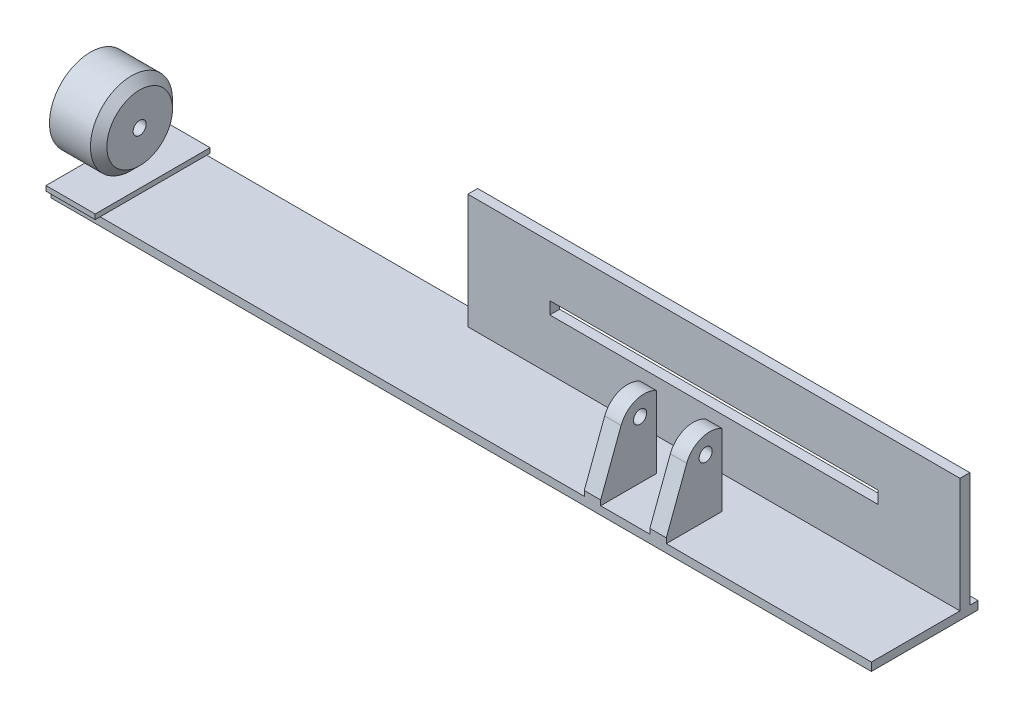
ISO-10303-21;
HEADER;
FILE_DESCRIPTION(('STEP AP214'),'2;1');
FILE_NAME('part.step','',(''),(''),'','','');
FILE_SCHEMA(('AUTOMOTIVE_DESIGN { 1 0 10303 214 1 1 1 1 }'));
ENDSEC;
DATA;
#1=APPLICATION_CONTEXT('core data for automotive mechanical design processes');
#2=APPLICATION_PROTOCOL_DEFINITION('international standard','automotive_design',2000,#1);
#3=PRODUCT_CONTEXT('',#1,'mechanical');
#4=PRODUCT('Part','Part','',(#3));
#5=PRODUCT_RELATED_PRODUCT_CATEGORY('part','',(#4));
#6=PRODUCT_DEFINITION_FORMATION('','',#4);
#7=PRODUCT_DEFINITION_CONTEXT('part definition',#1,'design');
#8=PRODUCT_DEFINITION('design','',#6,#7);
#9=PRODUCT_DEFINITION_SHAPE('','',#8);
#10=(LENGTH_UNIT() NAMED_UNIT(*) SI_UNIT(.MILLI.,.METRE.));
#11=(NAMED_UNIT(*) PLANE_ANGLE_UNIT() SI_UNIT($,.RADIAN.));
#12=(NAMED_UNIT(*) SI_UNIT($,.STERADIAN.) SOLID_ANGLE_UNIT());
#13=UNCERTAINTY_MEASURE_WITH_UNIT(LENGTH_MEASURE(1.E-05),#10,'distance_accuracy_value','');
#14=(GEOMETRIC_REPRESENTATION_CONTEXT(3) GLOBAL_UNCERTAINTY_ASSIGNED_CONTEXT((#13)) GLOBAL_UNIT_ASSIGNED_CONTEXT((#10,
#11,#12)) REPRESENTATION_CONTEXT('',''));
#15=CARTESIAN_POINT('',(0.,0.,0.));
#16=DIRECTION('',(0.,0.,1.));
#17=DIRECTION('',(1.,0.,0.));
#18=AXIS2_PLACEMENT_3D('',#15,#16,#17);
#19=CARTESIAN_POINT('',(-220.,40.,8.49999999999999));
#20=DIRECTION('',(-1.,0.,0.));
#21=DIRECTION('',(0.,0.,1.));
#22=AXIS2_PLACEMENT_3D('',#19,#20,#21);
#23=CYLINDRICAL_SURFACE('',#22,25.);
#24=CARTESIAN_POINT('',(-225.,40.,8.49999999999999));
#25=DIRECTION('',(1.,0.,0.));
#26=DIRECTION('',(0.,0.,-1.));
#27=AXIS2_PLACEMENT_3D('',#24,#25,#26);
#28=CIRCLE('',#27,25.);
#29=CARTESIAN_POINT('',(-225.,40.,-16.5));
#30=VERTEX_POINT('',#29);
#31=EDGE_CURVE('E11',#30,#30,#28,.F.);
#32=ORIENTED_EDGE('',*,*,#31,.T.);
#33=EDGE_LOOP('',(#32));
#34=FACE_BOUND('',#33,.T.);
#35=CARTESIAN_POINT('',(-250.,40.,8.49999999999999));
#36=DIRECTION('',(1.,0.,0.));
#37=DIRECTION('',(0.,0.,-1.));
#38=AXIS2_PLACEMENT_3D('',#35,#36,#37);
#39=CIRCLE('',#38,25.);
#40=CARTESIAN_POINT('',(-250.,40.,-16.5));
#41=VERTEX_POINT('',#40);
#42=EDGE_CURVE('E60',#41,#41,#39,.T.);
#43=ORIENTED_EDGE('',*,*,#42,.T.);
#44=EDGE_LOOP('',(#43));
#45=FACE_BOUND('',#44,.T.);
#46=ADVANCED_FACE('F49',(#34,#45),#23,.T.);
#47=CARTESIAN_POINT('',(-220.,40.,8.49999999999999));
#48=DIRECTION('',(1.,0.,0.));
#49=DIRECTION('',(0.,0.,-1.));
#50=AXIS2_PLACEMENT_3D('',#47,#48,#49);
#51=PLANE('',#50);
#52=CARTESIAN_POINT('',(-220.,40.,8.49999999999999));
#53=DIRECTION('',(1.,0.,0.));
#54=DIRECTION('',(0.,0.,-1.));
#55=AXIS2_PLACEMENT_3D('',#52,#53,#54);
#56=CIRCLE('',#55,4.);
#57=CARTESIAN_POINT('',(-220.,40.,4.49999999999998));
#58=VERTEX_POINT('',#57);
#59=EDGE_CURVE('E67',#58,#58,#56,.T.);
#60=ORIENTED_EDGE('',*,*,#59,.F.);
#61=EDGE_LOOP('',(#60));
#62=FACE_BOUND('',#61,.T.);
#63=CARTESIAN_POINT('',(-220.,40.,8.49999999999999));
#64=DIRECTION('',(1.,0.,0.));
#65=DIRECTION('',(0.,0.,-1.));
#66=AXIS2_PLACEMENT_3D('',#63,#64,#65);
#67=CIRCLE('',#66,20.);
#68=CARTESIAN_POINT('',(-220.,40.,-11.5));
#69=VERTEX_POINT('',#68);
#70=EDGE_CURVE('E56',#69,#69,#67,.T.);
#71=ORIENTED_EDGE('',*,*,#70,.T.);
#72=EDGE_LOOP('',(#71));
#73=FACE_BOUND('',#72,.T.);
#74=ADVANCED_FACE('F81',(#62,#73),#51,.T.);
#75=CARTESIAN_POINT('',(-250.,40.,8.49999999999999));
#76=DIRECTION('',(1.,0.,0.));
#77=DIRECTION('',(0.,0.,-1.));
#78=AXIS2_PLACEMENT_3D('',#75,#76,#77);
#79=PLANE('',#78);
#80=ORIENTED_EDGE('',*,*,#42,.F.);
#81=EDGE_LOOP('',(#80));
#82=FACE_BOUND('',#81,.T.);
#83=ADVANCED_FACE('F83',(#82),#79,.F.);
#84=CARTESIAN_POINT('',(-220.,40.,8.49999999999999));
#85=DIRECTION('',(-1.,0.,0.));
#86=DIRECTION('',(0.,0.,1.));
#87=AXIS2_PLACEMENT_3D('',#84,#85,#86);
#88=CONICAL_SURFACE('',#87,20.,0.785398163397446);
#89=ORIENTED_EDGE('',*,*,#31,.F.);
#90=EDGE_LOOP('',(#89));
#91=FACE_BOUND('',#90,.T.);
#92=ORIENTED_EDGE('',*,*,#70,.F.);
#93=EDGE_LOOP('',(#92));
#94=FACE_BOUND('',#93,.T.);
#95=ADVANCED_FACE('F51',(#91,#94),#88,.T.);
#96=CARTESIAN_POINT('',(-230.,40.,8.49999999999999));
#97=DIRECTION('',(1.,0.,0.));
#98=DIRECTION('',(0.,0.,-1.));
#99=AXIS2_PLACEMENT_3D('',#96,#97,#98);
#100=CYLINDRICAL_SURFACE('',#99,4.);
#101=CARTESIAN_POINT('',(-230.,40.,8.49999999999999));
#102=DIRECTION('',(1.,0.,0.));
#103=DIRECTION('',(0.,0.,-1.));
#104=AXIS2_PLACEMENT_3D('',#101,#102,#103);
#105=CIRCLE('',#104,4.);
#106=CARTESIAN_POINT('',(-230.,40.,4.49999999999998));
#107=VERTEX_POINT('',#106);
#108=EDGE_CURVE('E64',#107,#107,#105,.T.);
#109=ORIENTED_EDGE('',*,*,#108,.F.);
#110=EDGE_LOOP('',(#109));
#111=FACE_BOUND('',#110,.T.);
#112=ORIENTED_EDGE('',*,*,#59,.T.);
#113=EDGE_LOOP('',(#112));
#114=FACE_BOUND('',#113,.T.);
#115=ADVANCED_FACE('F75',(#111,#114),#100,.F.);
#116=CARTESIAN_POINT('',(-230.,40.,8.49999999999999));
#117=DIRECTION('',(1.,0.,0.));
#118=DIRECTION('',(0.,0.,-1.));
#119=AXIS2_PLACEMENT_3D('',#116,#117,#118);
#120=PLANE('',#119);
#121=ORIENTED_EDGE('',*,*,#108,.T.);
#122=EDGE_LOOP('',(#121));
#123=FACE_BOUND('',#122,.T.);
#124=ADVANCED_FACE('F73',(#123),#120,.T.);
#125=CLOSED_SHELL('',(#46,#74,#83,#95,#115,#124));
#126=MANIFOLD_SOLID_BREP('B2',#125);
#127=CARTESIAN_POINT('',(0.,5.,0.));
#128=DIRECTION('',(0.,-1.,0.));
#129=DIRECTION('',(0.,0.,-1.));
#130=AXIS2_PLACEMENT_3D('',#127,#128,#129);
#131=PLANE('',#130);
#132=DIRECTION('',(0.,0.,-1.));
#133=VECTOR('',#132,1.);
#134=CARTESIAN_POINT('',(-220.094269374493,5.,-34.5));
#135=LINE('',#134,#133);
#136=CARTESIAN_POINT('',(-220.094269374493,5.,32.5));
#137=VERTEX_POINT('',#136);
#138=CARTESIAN_POINT('',(-220.094269374493,5.,-32.5));
#139=VERTEX_POINT('',#138);
#140=EDGE_CURVE('E785',#137,#139,#135,.T.);
#141=ORIENTED_EDGE('',*,*,#140,.F.);
#142=DIRECTION('',(1.,0.,0.));
#143=VECTOR('',#142,1.);
#144=CARTESIAN_POINT('',(-250.,5.,32.5));
#145=LINE('',#144,#143);
#146=CARTESIAN_POINT('',(75.,5.,32.5));
#147=VERTEX_POINT('',#146);
#148=EDGE_CURVE('E492',#137,#147,#145,.T.);
#149=ORIENTED_EDGE('',*,*,#148,.T.);
#150=DIRECTION('',(0.,0.,-1.));
#151=VECTOR('',#150,1.);
#152=CARTESIAN_POINT('',(75.,5.,-1.50000000000002));
#153=LINE('',#152,#151);
#154=CARTESIAN_POINT('',(75.,5.,-1.50000000000002));
#155=VERTEX_POINT('',#154);
#156=EDGE_CURVE('E147',#147,#155,#153,.T.);
#157=ORIENTED_EDGE('',*,*,#156,.T.);
#158=DIRECTION('',(1.,0.,0.));
#159=VECTOR('',#158,1.);
#160=CARTESIAN_POINT('',(75.,5.,-1.50000000000002));
#161=LINE('',#160,#159);
#162=CARTESIAN_POINT('',(85.,5.,-1.50000000000002));
#163=VERTEX_POINT('',#162);
#164=EDGE_CURVE('E360',#155,#163,#161,.T.);
#165=ORIENTED_EDGE('',*,*,#164,.T.);
#166=DIRECTION('',(0.,0.,-1.));
#167=VECTOR('',#166,1.);
#168=CARTESIAN_POINT('',(85.,5.,-1.50000000000002));
#169=LINE('',#168,#167);
#170=CARTESIAN_POINT('',(85.,5.,32.5));
#171=VERTEX_POINT('',#170);
#172=EDGE_CURVE('E345',#171,#163,#169,.T.);
#173=ORIENTED_EDGE('',*,*,#172,.F.);
#174=CARTESIAN_POINT('',(115.,5.,32.5));
#175=VERTEX_POINT('',#174);
#176=EDGE_CURVE('E781',#171,#175,#145,.T.);
#177=ORIENTED_EDGE('',*,*,#176,.T.);
#178=DIRECTION('',(0.,0.,-1.));
#179=VECTOR('',#178,1.);
#180=CARTESIAN_POINT('',(115.,5.,-1.50000000000002));
#181=LINE('',#180,#179);
#182=CARTESIAN_POINT('',(115.,5.,-1.50000000000002));
#183=VERTEX_POINT('',#182);
#184=EDGE_CURVE('E381',#175,#183,#181,.T.);
#185=ORIENTED_EDGE('',*,*,#184,.T.);
#186=DIRECTION('',(-1.,0.,0.));
#187=VECTOR('',#186,1.);
#188=CARTESIAN_POINT('',(125.,5.,-1.50000000000002));
#189=LINE('',#188,#187);
#190=CARTESIAN_POINT('',(125.,5.,-1.50000000000002));
#191=VERTEX_POINT('',#190);
#192=EDGE_CURVE('E413',#191,#183,#189,.T.);
#193=ORIENTED_EDGE('',*,*,#192,.F.);
#194=DIRECTION('',(0.,0.,-1.));
#195=VECTOR('',#194,1.);
#196=CARTESIAN_POINT('',(125.,5.,-1.50000000000002));
#197=LINE('',#196,#195);
#198=CARTESIAN_POINT('',(125.,5.,32.5));
#199=VERTEX_POINT('',#198);
#200=EDGE_CURVE('E382',#199,#191,#197,.T.);
#201=ORIENTED_EDGE('',*,*,#200,.F.);
#202=CARTESIAN_POINT('',(250.,5.,32.5));
#203=VERTEX_POINT('',#202);
#204=EDGE_CURVE('E487',#199,#203,#145,.T.);
#205=ORIENTED_EDGE('',*,*,#204,.T.);
#206=DIRECTION('',(0.,0.,-1.));
#207=VECTOR('',#206,1.);
#208=CARTESIAN_POINT('',(250.,5.,32.5));
#209=LINE('',#208,#207);
#210=CARTESIAN_POINT('',(250.,5.,-21.5));
#211=VERTEX_POINT('',#210);
#212=EDGE_CURVE('E479',#203,#211,#209,.T.);
#213=ORIENTED_EDGE('',*,*,#212,.T.);
#214=DIRECTION('',(1.,0.,0.));
#215=VECTOR('',#214,1.);
#216=CARTESIAN_POINT('',(-49.9999999999999,5.,-21.5));
#217=LINE('',#216,#215);
#218=CARTESIAN_POINT('',(-49.9999999999999,5.,-21.5));
#219=VERTEX_POINT('',#218);
#220=EDGE_CURVE('E453',#219,#211,#217,.T.);
#221=ORIENTED_EDGE('',*,*,#220,.F.);
#222=DIRECTION('',(0.,0.,1.));
#223=VECTOR('',#222,1.);
#224=CARTESIAN_POINT('',(-49.9999999999999,5.,-27.5));
#225=LINE('',#224,#223);
#226=CARTESIAN_POINT('',(-49.9999999999999,5.,-27.5));
#227=VERTEX_POINT('',#226);
#228=EDGE_CURVE('E462',#227,#219,#225,.T.);
#229=ORIENTED_EDGE('',*,*,#228,.F.);
#230=DIRECTION('',(-1.,0.,0.));
#231=VECTOR('',#230,1.);
#232=CARTESIAN_POINT('',(250.,5.,-27.5));
#233=LINE('',#232,#231);
#234=CARTESIAN_POINT('',(250.,5.,-27.5));
#235=VERTEX_POINT('',#234);
#236=EDGE_CURVE('E448',#235,#227,#233,.T.);
#237=ORIENTED_EDGE('',*,*,#236,.F.);
#238=CARTESIAN_POINT('',(250.,5.,-32.5));
#239=VERTEX_POINT('',#238);
#240=EDGE_CURVE('E482',#235,#239,#209,.T.);
#241=ORIENTED_EDGE('',*,*,#240,.T.);
#242=DIRECTION('',(-1.,0.,0.));
#243=VECTOR('',#242,1.);
#244=CARTESIAN_POINT('',(-250.,5.,-32.5));
#245=LINE('',#244,#243);
#246=EDGE_CURVE('E481',#239,#139,#245,.T.);
#247=ORIENTED_EDGE('',*,*,#246,.T.);
#248=EDGE_LOOP('',(#141,#149,#157,#165,#173,#177,#185,#193,#201,#205,#213,#221,#229,#237,#241,#247));
#249=FACE_BOUND('',#248,.T.);
#250=ADVANCED_FACE('F123',(#249),#131,.F.);
#251=CARTESIAN_POINT('',(250.,5.,32.5));
#252=DIRECTION('',(-1.,0.,0.));
#253=DIRECTION('',(0.,0.,1.));
#254=AXIS2_PLACEMENT_3D('',#251,#252,#253);
#255=PLANE('',#254);
#256=DIRECTION('',(0.,0.,-1.));
#257=VECTOR('',#256,1.);
#258=CARTESIAN_POINT('',(250.,0.,32.5));
#259=LINE('',#258,#257);
#260=CARTESIAN_POINT('',(250.,0.,32.5));
#261=VERTEX_POINT('',#260);
#262=CARTESIAN_POINT('',(250.,0.,-32.5));
#263=VERTEX_POINT('',#262);
#264=EDGE_CURVE('E478',#261,#263,#259,.T.);
#265=ORIENTED_EDGE('',*,*,#264,.T.);
#266=DIRECTION('',(0.,-1.,0.));
#267=VECTOR('',#266,1.);
#268=CARTESIAN_POINT('',(250.,5.,-32.5));
#269=LINE('',#268,#267);
#270=EDGE_CURVE('E47',#239,#263,#269,.T.);
#271=ORIENTED_EDGE('',*,*,#270,.F.);
#272=ORIENTED_EDGE('',*,*,#240,.F.);
#273=DIRECTION('',(0.,-1.,0.));
#274=VECTOR('',#273,1.);
#275=CARTESIAN_POINT('',(250.,75.,-27.5));
#276=LINE('',#275,#274);
#277=CARTESIAN_POINT('',(250.,75.,-27.5));
#278=VERTEX_POINT('',#277);
#279=EDGE_CURVE('E475',#278,#235,#276,.T.);
#280=ORIENTED_EDGE('',*,*,#279,.F.);
#281=DIRECTION('',(0.,0.,-1.));
#282=VECTOR('',#281,1.);
#283=CARTESIAN_POINT('',(250.,75.,-21.5));
#284=LINE('',#283,#282);
#285=CARTESIAN_POINT('',(250.,75.,-21.5));
#286=VERTEX_POINT('',#285);
#287=EDGE_CURVE('E449',#286,#278,#284,.T.);
#288=ORIENTED_EDGE('',*,*,#287,.F.);
#289=DIRECTION('',(0.,-1.,0.));
#290=VECTOR('',#289,1.);
#291=CARTESIAN_POINT('',(250.,75.,-21.5));
#292=LINE('',#291,#290);
#293=EDGE_CURVE('E459',#286,#211,#292,.T.);
#294=ORIENTED_EDGE('',*,*,#293,.T.);
#295=ORIENTED_EDGE('',*,*,#212,.F.);
#296=DIRECTION('',(0.,-1.,0.));
#297=VECTOR('',#296,1.);
#298=CARTESIAN_POINT('',(250.,5.,32.5));
#299=LINE('',#298,#297);
#300=EDGE_CURVE('E491',#203,#261,#299,.T.);
#301=ORIENTED_EDGE('',*,*,#300,.T.);
#302=EDGE_LOOP('',(#265,#271,#272,#280,#288,#294,#295,#301));
#303=FACE_BOUND('',#302,.T.);
#304=ADVANCED_FACE('F125',(#303),#255,.F.);
#305=CARTESIAN_POINT('',(-250.,5.,-32.5));
#306=DIRECTION('',(0.,0.,1.));
#307=DIRECTION('',(1.,0.,0.));
#308=AXIS2_PLACEMENT_3D('',#305,#306,#307);
#309=PLANE('',#308);
#310=DIRECTION('',(-1.,0.,0.));
#311=VECTOR('',#310,1.);
#312=CARTESIAN_POINT('',(-250.,0.,-32.5));
#313=LINE('',#312,#311);
#314=CARTESIAN_POINT('',(-250.,0.,-32.5));
#315=VERTEX_POINT('',#314);
#316=EDGE_CURVE('E495',#263,#315,#313,.T.);
#317=ORIENTED_EDGE('',*,*,#316,.T.);
#318=DIRECTION('',(0.,-1.,0.));
#319=VECTOR('',#318,1.);
#320=CARTESIAN_POINT('',(-250.,5.,-32.5));
#321=LINE('',#320,#319);
#322=CARTESIAN_POINT('',(-250.,5.,-32.5));
#323=VERTEX_POINT('',#322);
#324=EDGE_CURVE('E132',#323,#315,#321,.T.);
#325=ORIENTED_EDGE('',*,*,#324,.F.);
#326=DIRECTION('',(1.,0.,0.));
#327=VECTOR('',#326,1.);
#328=CARTESIAN_POINT('',(-250.,5.,-32.5));
#329=LINE('',#328,#327);
#330=EDGE_CURVE('E139',#323,#139,#329,.T.);
#331=ORIENTED_EDGE('',*,*,#330,.T.);
#332=ORIENTED_EDGE('',*,*,#246,.F.);
#333=ORIENTED_EDGE('',*,*,#270,.T.);
#334=EDGE_LOOP('',(#317,#325,#331,#332,#333));
#335=FACE_BOUND('',#334,.T.);
#336=ADVANCED_FACE('F539',(#335),#309,.F.);
#337=CARTESIAN_POINT('',(-250.,5.,32.5));
#338=DIRECTION('',(1.,0.,0.));
#339=DIRECTION('',(0.,0.,-1.));
#340=AXIS2_PLACEMENT_3D('',#337,#338,#339);
#341=PLANE('',#340);
#342=DIRECTION('',(0.,0.,1.));
#343=VECTOR('',#342,1.);
#344=CARTESIAN_POINT('',(-250.,0.,32.5));
#345=LINE('',#344,#343);
#346=CARTESIAN_POINT('',(-250.,0.,32.5));
#347=VERTEX_POINT('',#346);
#348=EDGE_CURVE('E497',#315,#347,#345,.T.);
#349=ORIENTED_EDGE('',*,*,#348,.T.);
#350=DIRECTION('',(0.,-1.,0.));
#351=VECTOR('',#350,1.);
#352=CARTESIAN_POINT('',(-250.,5.,32.5));
#353=LINE('',#352,#351);
#354=CARTESIAN_POINT('',(-250.,5.,32.5));
#355=VERTEX_POINT('',#354);
#356=EDGE_CURVE('E503',#355,#347,#353,.T.);
#357=ORIENTED_EDGE('',*,*,#356,.F.);
#358=DIRECTION('',(0.,0.,1.));
#359=VECTOR('',#358,1.);
#360=CARTESIAN_POINT('',(-250.,5.,32.5));
#361=LINE('',#360,#359);
#362=EDGE_CURVE('E484',#323,#355,#361,.T.);
#363=ORIENTED_EDGE('',*,*,#362,.F.);
#364=ORIENTED_EDGE('',*,*,#324,.T.);
#365=EDGE_LOOP('',(#349,#357,#363,#364));
#366=FACE_BOUND('',#365,.T.);
#367=ADVANCED_FACE('F510',(#366),#341,.F.);
#368=CARTESIAN_POINT('',(-250.,5.,32.5));
#369=DIRECTION('',(0.,0.,-1.));
#370=DIRECTION('',(-1.,0.,0.));
#371=AXIS2_PLACEMENT_3D('',#368,#369,#370);
#372=PLANE('',#371);
#373=DIRECTION('',(1.,0.,0.));
#374=VECTOR('',#373,1.);
#375=CARTESIAN_POINT('',(-250.,0.,32.5));
#376=LINE('',#375,#374);
#377=EDGE_CURVE('E499',#347,#261,#376,.T.);
#378=ORIENTED_EDGE('',*,*,#377,.T.);
#379=ORIENTED_EDGE('',*,*,#300,.F.);
#380=ORIENTED_EDGE('',*,*,#204,.F.);
#381=DIRECTION('',(0.,-1.,0.));
#382=VECTOR('',#381,1.);
#383=CARTESIAN_POINT('',(125.,5.,32.5));
#384=LINE('',#383,#382);
#385=CARTESIAN_POINT('',(125.,8.06038150401972,32.5));
#386=VERTEX_POINT('',#385);
#387=EDGE_CURVE('E392',#386,#199,#384,.T.);
#388=ORIENTED_EDGE('',*,*,#387,.F.);
#389=DIRECTION('',(-1.,0.,0.));
#390=VECTOR('',#389,1.);
#391=CARTESIAN_POINT('',(125.,8.06038150401972,32.5));
#392=LINE('',#391,#390);
#393=CARTESIAN_POINT('',(115.,8.06038150401972,32.5));
#394=VERTEX_POINT('',#393);
#395=EDGE_CURVE('E395',#386,#394,#392,.T.);
#396=ORIENTED_EDGE('',*,*,#395,.T.);
#397=DIRECTION('',(0.,-1.,0.));
#398=VECTOR('',#397,1.);
#399=CARTESIAN_POINT('',(115.,5.,32.5));
#400=LINE('',#399,#398);
#401=EDGE_CURVE('E386',#394,#175,#400,.T.);
#402=ORIENTED_EDGE('',*,*,#401,.T.);
#403=ORIENTED_EDGE('',*,*,#176,.F.);
#404=DIRECTION('',(0.,-1.,0.));
#405=VECTOR('',#404,1.);
#406=CARTESIAN_POINT('',(85.,5.,32.5));
#407=LINE('',#406,#405);
#408=CARTESIAN_POINT('',(85.,8.06038150401972,32.5));
#409=VERTEX_POINT('',#408);
#410=EDGE_CURVE('E363',#409,#171,#407,.T.);
#411=ORIENTED_EDGE('',*,*,#410,.F.);
#412=DIRECTION('',(1.,0.,0.));
#413=VECTOR('',#412,1.);
#414=CARTESIAN_POINT('',(75.,8.06038150401972,32.5));
#415=LINE('',#414,#413);
#416=CARTESIAN_POINT('',(75.,8.06038150401972,32.5));
#417=VERTEX_POINT('',#416);
#418=EDGE_CURVE('E379',#417,#409,#415,.T.);
#419=ORIENTED_EDGE('',*,*,#418,.F.);
#420=DIRECTION('',(0.,-1.,0.));
#421=VECTOR('',#420,1.);
#422=CARTESIAN_POINT('',(75.,5.,32.5));
#423=LINE('',#422,#421);
#424=EDGE_CURVE('E347',#417,#147,#423,.T.);
#425=ORIENTED_EDGE('',*,*,#424,.T.);
#426=ORIENTED_EDGE('',*,*,#148,.F.);
#427=EDGE_CURVE('E488',#355,#137,#145,.T.);
#428=ORIENTED_EDGE('',*,*,#427,.F.);
#429=ORIENTED_EDGE('',*,*,#356,.T.);
#430=EDGE_LOOP('',(#378,#379,#380,#388,#396,#402,#403,#411,#419,#425,#426,#428,#429));
#431=FACE_BOUND('',#430,.T.);
#432=ADVANCED_FACE('F517',(#431),#372,.F.);
#433=CARTESIAN_POINT('',(0.,0.,0.));
#434=DIRECTION('',(0.,-1.,0.));
#435=DIRECTION('',(0.,0.,-1.));
#436=AXIS2_PLACEMENT_3D('',#433,#434,#435);
#437=PLANE('',#436);
#438=ORIENTED_EDGE('',*,*,#264,.F.);
#439=ORIENTED_EDGE('',*,*,#377,.F.);
#440=ORIENTED_EDGE('',*,*,#348,.F.);
#441=ORIENTED_EDGE('',*,*,#316,.F.);
#442=EDGE_LOOP('',(#438,#439,#440,#441));
#443=FACE_BOUND('',#442,.T.);
#444=ADVANCED_FACE('F514',(#443),#437,.T.);
#445=CARTESIAN_POINT('',(250.,75.,-27.5));
#446=DIRECTION('',(0.,0.,1.));
#447=DIRECTION('',(1.,0.,0.));
#448=AXIS2_PLACEMENT_3D('',#445,#446,#447);
#449=PLANE('',#448);
#450=DIRECTION('',(0.,-1.,0.));
#451=VECTOR('',#450,1.);
#452=CARTESIAN_POINT('',(1.11022302462516E-13,75.,-27.5));
#453=LINE('',#452,#451);
#454=CARTESIAN_POINT('',(1.11022302462516E-13,43.765,-27.5));
#455=VERTEX_POINT('',#454);
#456=CARTESIAN_POINT('',(1.11022302462516E-13,36.235,-27.5));
#457=VERTEX_POINT('',#456);
#458=EDGE_CURVE('E442',#455,#457,#453,.T.);
#459=ORIENTED_EDGE('',*,*,#458,.T.);
#460=DIRECTION('',(1.,0.,0.));
#461=VECTOR('',#460,1.);
#462=CARTESIAN_POINT('',(250.,36.235,-27.5));
#463=LINE('',#462,#461);
#464=CARTESIAN_POINT('',(200.,36.235,-27.5));
#465=VERTEX_POINT('',#464);
#466=EDGE_CURVE('E445',#457,#465,#463,.T.);
#467=ORIENTED_EDGE('',*,*,#466,.T.);
#468=DIRECTION('',(0.,1.,0.));
#469=VECTOR('',#468,1.);
#470=CARTESIAN_POINT('',(200.,75.,-27.5));
#471=LINE('',#470,#469);
#472=CARTESIAN_POINT('',(200.,43.765,-27.5));
#473=VERTEX_POINT('',#472);
#474=EDGE_CURVE('E430',#465,#473,#471,.T.);
#475=ORIENTED_EDGE('',*,*,#474,.T.);
#476=DIRECTION('',(-1.,0.,0.));
#477=VECTOR('',#476,1.);
#478=CARTESIAN_POINT('',(250.,43.765,-27.5));
#479=LINE('',#478,#477);
#480=EDGE_CURVE('E439',#473,#455,#479,.T.);
#481=ORIENTED_EDGE('',*,*,#480,.T.);
#482=EDGE_LOOP('',(#459,#467,#475,#481));
#483=FACE_BOUND('',#482,.T.);
#484=ORIENTED_EDGE('',*,*,#236,.T.);
#485=DIRECTION('',(0.,-1.,0.));
#486=VECTOR('',#485,1.);
#487=CARTESIAN_POINT('',(-49.9999999999999,75.,-27.5));
#488=LINE('',#487,#486);
#489=CARTESIAN_POINT('',(-49.9999999999999,75.,-27.5));
#490=VERTEX_POINT('',#489);
#491=EDGE_CURVE('E472',#490,#227,#488,.T.);
#492=ORIENTED_EDGE('',*,*,#491,.F.);
#493=DIRECTION('',(-1.,0.,0.));
#494=VECTOR('',#493,1.);
#495=CARTESIAN_POINT('',(250.,75.,-27.5));
#496=LINE('',#495,#494);
#497=EDGE_CURVE('E452',#278,#490,#496,.T.);
#498=ORIENTED_EDGE('',*,*,#497,.F.);
#499=ORIENTED_EDGE('',*,*,#279,.T.);
#500=EDGE_LOOP('',(#484,#492,#498,#499));
#501=FACE_BOUND('',#500,.T.);
#502=ADVANCED_FACE('F536',(#483,#501),#449,.F.);
#503=CARTESIAN_POINT('',(-49.9999999999999,75.,-27.5));
#504=DIRECTION('',(1.,0.,0.));
#505=DIRECTION('',(0.,0.,-1.));
#506=AXIS2_PLACEMENT_3D('',#503,#504,#505);
#507=PLANE('',#506);
#508=ORIENTED_EDGE('',*,*,#228,.T.);
#509=DIRECTION('',(0.,-1.,0.));
#510=VECTOR('',#509,1.);
#511=CARTESIAN_POINT('',(-49.9999999999999,75.,-21.5));
#512=LINE('',#511,#510);
#513=CARTESIAN_POINT('',(-49.9999999999999,75.,-21.5));
#514=VERTEX_POINT('',#513);
#515=EDGE_CURVE('E469',#514,#219,#512,.T.);
#516=ORIENTED_EDGE('',*,*,#515,.F.);
#517=DIRECTION('',(0.,0.,1.));
#518=VECTOR('',#517,1.);
#519=CARTESIAN_POINT('',(-49.9999999999999,75.,-27.5));
#520=LINE('',#519,#518);
#521=EDGE_CURVE('E455',#490,#514,#520,.T.);
#522=ORIENTED_EDGE('',*,*,#521,.F.);
#523=ORIENTED_EDGE('',*,*,#491,.T.);
#524=EDGE_LOOP('',(#508,#516,#522,#523));
#525=FACE_BOUND('',#524,.T.);
#526=ADVANCED_FACE('F532',(#525),#507,.F.);
#527=CARTESIAN_POINT('',(-49.9999999999999,75.,-21.5));
#528=DIRECTION('',(0.,0.,-1.));
#529=DIRECTION('',(-1.,0.,0.));
#530=AXIS2_PLACEMENT_3D('',#527,#528,#529);
#531=PLANE('',#530);
#532=DIRECTION('',(0.,1.,0.));
#533=VECTOR('',#532,1.);
#534=CARTESIAN_POINT('',(200.,43.765,-21.5));
#535=LINE('',#534,#533);
#536=CARTESIAN_POINT('',(200.,36.235,-21.5));
#537=VERTEX_POINT('',#536);
#538=CARTESIAN_POINT('',(200.,43.765,-21.5));
#539=VERTEX_POINT('',#538);
#540=EDGE_CURVE('E418',#537,#539,#535,.T.);
#541=ORIENTED_EDGE('',*,*,#540,.F.);
#542=DIRECTION('',(1.,0.,0.));
#543=VECTOR('',#542,1.);
#544=CARTESIAN_POINT('',(200.,36.235,-21.5));
#545=LINE('',#544,#543);
#546=CARTESIAN_POINT('',(1.11022302462516E-13,36.235,-21.5));
#547=VERTEX_POINT('',#546);
#548=EDGE_CURVE('E416',#547,#537,#545,.T.);
#549=ORIENTED_EDGE('',*,*,#548,.F.);
#550=DIRECTION('',(0.,-1.,0.));
#551=VECTOR('',#550,1.);
#552=CARTESIAN_POINT('',(1.11022302462516E-13,40.,-21.5));
#553=LINE('',#552,#551);
#554=CARTESIAN_POINT('',(1.11022302462516E-13,43.765,-21.5));
#555=VERTEX_POINT('',#554);
#556=EDGE_CURVE('E424',#555,#547,#553,.T.);
#557=ORIENTED_EDGE('',*,*,#556,.F.);
#558=DIRECTION('',(-1.,0.,0.));
#559=VECTOR('',#558,1.);
#560=CARTESIAN_POINT('',(1.11022302462516E-13,43.765,-21.5));
#561=LINE('',#560,#559);
#562=EDGE_CURVE('E421',#539,#555,#561,.T.);
#563=ORIENTED_EDGE('',*,*,#562,.F.);
#564=EDGE_LOOP('',(#541,#549,#557,#563));
#565=FACE_BOUND('',#564,.T.);
#566=ORIENTED_EDGE('',*,*,#220,.T.);
#567=ORIENTED_EDGE('',*,*,#293,.F.);
#568=DIRECTION('',(1.,0.,0.));
#569=VECTOR('',#568,1.);
#570=CARTESIAN_POINT('',(-49.9999999999999,75.,-21.5));
#571=LINE('',#570,#569);
#572=EDGE_CURVE('E457',#514,#286,#571,.T.);
#573=ORIENTED_EDGE('',*,*,#572,.F.);
#574=ORIENTED_EDGE('',*,*,#515,.T.);
#575=EDGE_LOOP('',(#566,#567,#573,#574));
#576=FACE_BOUND('',#575,.T.);
#577=ADVANCED_FACE('F527',(#565,#576),#531,.F.);
#578=CARTESIAN_POINT('',(0.,75.,0.));
#579=DIRECTION('',(0.,1.,0.));
#580=DIRECTION('',(0.,0.,1.));
#581=AXIS2_PLACEMENT_3D('',#578,#579,#580);
#582=PLANE('',#581);
#583=ORIENTED_EDGE('',*,*,#287,.T.);
#584=ORIENTED_EDGE('',*,*,#497,.T.);
#585=ORIENTED_EDGE('',*,*,#521,.T.);
#586=ORIENTED_EDGE('',*,*,#572,.T.);
#587=EDGE_LOOP('',(#583,#584,#585,#586));
#588=FACE_BOUND('',#587,.T.);
#589=ADVANCED_FACE('F668',(#588),#582,.T.);
#590=CARTESIAN_POINT('',(200.,36.235,-32.5));
#591=DIRECTION('',(0.,-1.,0.));
#592=DIRECTION('',(0.,0.,-1.));
#593=AXIS2_PLACEMENT_3D('',#590,#591,#592);
#594=PLANE('',#593);
#595=DIRECTION('',(0.,0.,1.));
#596=VECTOR('',#595,1.);
#597=CARTESIAN_POINT('',(1.11022302462516E-13,36.235,-32.5));
#598=LINE('',#597,#596);
#599=EDGE_CURVE('E428',#457,#547,#598,.T.);
#600=ORIENTED_EDGE('',*,*,#599,.T.);
#601=ORIENTED_EDGE('',*,*,#548,.T.);
#602=DIRECTION('',(0.,0.,1.));
#603=VECTOR('',#602,1.);
#604=CARTESIAN_POINT('',(200.,36.235,-32.5));
#605=LINE('',#604,#603);
#606=EDGE_CURVE('E427',#465,#537,#605,.T.);
#607=ORIENTED_EDGE('',*,*,#606,.F.);
#608=ORIENTED_EDGE('',*,*,#466,.F.);
#609=EDGE_LOOP('',(#600,#601,#607,#608));
#610=FACE_BOUND('',#609,.T.);
#611=ADVANCED_FACE('F658',(#610),#594,.F.);
#612=CARTESIAN_POINT('',(1.11022302462516E-13,40.,-32.5));
#613=DIRECTION('',(-1.,0.,0.));
#614=DIRECTION('',(0.,0.,1.));
#615=AXIS2_PLACEMENT_3D('',#612,#613,#614);
#616=PLANE('',#615);
#617=DIRECTION('',(0.,0.,1.));
#618=VECTOR('',#617,1.);
#619=CARTESIAN_POINT('',(1.11022302462516E-13,43.765,-32.5));
#620=LINE('',#619,#618);
#621=EDGE_CURVE('E431',#455,#555,#620,.T.);
#622=ORIENTED_EDGE('',*,*,#621,.T.);
#623=ORIENTED_EDGE('',*,*,#556,.T.);
#624=ORIENTED_EDGE('',*,*,#599,.F.);
#625=ORIENTED_EDGE('',*,*,#458,.F.);
#626=EDGE_LOOP('',(#622,#623,#624,#625));
#627=FACE_BOUND('',#626,.T.);
#628=ADVANCED_FACE('F654',(#627),#616,.F.);
#629=CARTESIAN_POINT('',(1.11022302462516E-13,43.765,-32.5));
#630=DIRECTION('',(0.,1.,0.));
#631=DIRECTION('',(0.,0.,1.));
#632=AXIS2_PLACEMENT_3D('',#629,#630,#631);
#633=PLANE('',#632);
#634=DIRECTION('',(0.,0.,1.));
#635=VECTOR('',#634,1.);
#636=CARTESIAN_POINT('',(200.,43.765,-32.5));
#637=LINE('',#636,#635);
#638=EDGE_CURVE('E433',#473,#539,#637,.T.);
#639=ORIENTED_EDGE('',*,*,#638,.T.);
#640=ORIENTED_EDGE('',*,*,#562,.T.);
#641=ORIENTED_EDGE('',*,*,#621,.F.);
#642=ORIENTED_EDGE('',*,*,#480,.F.);
#643=EDGE_LOOP('',(#639,#640,#641,#642));
#644=FACE_BOUND('',#643,.T.);
#645=ADVANCED_FACE('F657',(#644),#633,.F.);
#646=CARTESIAN_POINT('',(200.,43.765,-32.5));
#647=DIRECTION('',(1.,0.,0.));
#648=DIRECTION('',(0.,0.,-1.));
#649=AXIS2_PLACEMENT_3D('',#646,#647,#648);
#650=PLANE('',#649);
#651=ORIENTED_EDGE('',*,*,#606,.T.);
#652=ORIENTED_EDGE('',*,*,#540,.T.);
#653=ORIENTED_EDGE('',*,*,#638,.F.);
#654=ORIENTED_EDGE('',*,*,#474,.F.);
#655=EDGE_LOOP('',(#651,#652,#653,#654));
#656=FACE_BOUND('',#655,.T.);
#657=ADVANCED_FACE('F652',(#656),#650,.F.);
#658=CARTESIAN_POINT('',(125.,48.8209531627066,-1.50000000000002));
#659=DIRECTION('',(0.,0.,1.));
#660=DIRECTION('',(0.,-1.,0.));
#661=AXIS2_PLACEMENT_3D('',#658,#659,#660);
#662=PLANE('',#661);
#663=DIRECTION('',(0.,1.,0.));
#664=VECTOR('',#663,1.);
#665=CARTESIAN_POINT('',(115.,48.8209531627066,-1.50000000000002));
#666=LINE('',#665,#664);
#667=CARTESIAN_POINT('',(115.,48.8209531627066,-1.50000000000002));
#668=VERTEX_POINT('',#667);
#669=EDGE_CURVE('E397',#183,#668,#666,.T.);
#670=ORIENTED_EDGE('',*,*,#669,.T.);
#671=DIRECTION('',(-1.,0.,0.));
#672=VECTOR('',#671,1.);
#673=CARTESIAN_POINT('',(125.,48.8209531627066,-1.50000000000002));
#674=LINE('',#673,#672);
#675=CARTESIAN_POINT('',(125.,48.8209531627066,-1.50000000000002));
#676=VERTEX_POINT('',#675);
#677=EDGE_CURVE('E410',#676,#668,#674,.T.);
#678=ORIENTED_EDGE('',*,*,#677,.F.);
#679=DIRECTION('',(0.,1.,0.));
#680=VECTOR('',#679,1.);
#681=CARTESIAN_POINT('',(125.,48.8209531627066,-1.50000000000002));
#682=LINE('',#681,#680);
#683=EDGE_CURVE('E385',#191,#676,#682,.T.);
#684=ORIENTED_EDGE('',*,*,#683,.F.);
#685=ORIENTED_EDGE('',*,*,#192,.T.);
#686=EDGE_LOOP('',(#670,#678,#684,#685));
#687=FACE_BOUND('',#686,.T.);
#688=ADVANCED_FACE('F648',(#687),#662,.F.);
#689=CARTESIAN_POINT('',(125.,35.9024008290873,6.04436958597597));
#690=DIRECTION('',(-1.,0.,0.));
#691=DIRECTION('',(0.,0.,1.));
#692=AXIS2_PLACEMENT_3D('',#689,#690,#691);
#693=CYLINDRICAL_SURFACE('',#692,14.9601639979734);
#694=CARTESIAN_POINT('',(115.,35.9024008290873,6.04436958597597));
#695=DIRECTION('',(1.,0.,0.));
#696=DIRECTION('',(0.,0.,-1.));
#697=AXIS2_PLACEMENT_3D('',#694,#695,#696);
#698=CIRCLE('',#697,14.9601639979734);
#699=CARTESIAN_POINT('',(115.,41.1691367257894,20.0467979411096));
#700=VERTEX_POINT('',#699);
#701=EDGE_CURVE('E399',#668,#700,#698,.T.);
#702=ORIENTED_EDGE('',*,*,#701,.T.);
#703=DIRECTION('',(-1.,0.,0.));
#704=VECTOR('',#703,1.);
#705=CARTESIAN_POINT('',(125.,41.1691367257894,20.0467979411096));
#706=LINE('',#705,#704);
#707=CARTESIAN_POINT('',(125.,41.1691367257894,20.0467979411096));
#708=VERTEX_POINT('',#707);
#709=EDGE_CURVE('E407',#708,#700,#706,.T.);
#710=ORIENTED_EDGE('',*,*,#709,.F.);
#711=CARTESIAN_POINT('',(125.,35.9024008290873,6.04436958597597));
#712=DIRECTION('',(1.,0.,0.));
#713=DIRECTION('',(0.,0.,-1.));
#714=AXIS2_PLACEMENT_3D('',#711,#712,#713);
#715=CIRCLE('',#714,14.9601639979734);
#716=EDGE_CURVE('E388',#676,#708,#715,.T.);
#717=ORIENTED_EDGE('',*,*,#716,.F.);
#718=ORIENTED_EDGE('',*,*,#677,.T.);
#719=EDGE_LOOP('',(#702,#710,#717,#718));
#720=FACE_BOUND('',#719,.T.);
#721=ADVANCED_FACE('F644',(#720),#693,.T.);
#722=CARTESIAN_POINT('',(125.,8.06038150401972,32.5));
#723=DIRECTION('',(0.,-0.352050679218189,-0.935980939582646));
#724=DIRECTION('',(0.,0.935980939582646,-0.352050679218189));
#725=AXIS2_PLACEMENT_3D('',#722,#723,#724);
#726=PLANE('',#725);
#727=DIRECTION('',(0.,-0.935980939582645,0.352050679218189));
#728=VECTOR('',#727,1.);
#729=CARTESIAN_POINT('',(115.,8.06038150401972,32.5));
#730=LINE('',#729,#728);
#731=EDGE_CURVE('E401',#700,#394,#730,.T.);
#732=ORIENTED_EDGE('',*,*,#731,.T.);
#733=ORIENTED_EDGE('',*,*,#395,.F.);
#734=DIRECTION('',(0.,-0.935980939582645,0.352050679218189));
#735=VECTOR('',#734,1.);
#736=CARTESIAN_POINT('',(125.,8.06038150401972,32.5));
#737=LINE('',#736,#735);
#738=EDGE_CURVE('E390',#708,#386,#737,.T.);
#739=ORIENTED_EDGE('',*,*,#738,.F.);
#740=ORIENTED_EDGE('',*,*,#709,.T.);
#741=EDGE_LOOP('',(#732,#733,#739,#740));
#742=FACE_BOUND('',#741,.T.);
#743=ADVANCED_FACE('F637',(#742),#726,.F.);
#744=CARTESIAN_POINT('',(125.,35.9024008290873,6.04436958597597));
#745=DIRECTION('',(1.,0.,0.));
#746=DIRECTION('',(0.,0.,-1.));
#747=AXIS2_PLACEMENT_3D('',#744,#745,#746);
#748=PLANE('',#747);
#749=CARTESIAN_POINT('',(125.,40.,8.49999999999999));
#750=DIRECTION('',(1.,0.,0.));
#751=DIRECTION('',(0.,0.,-1.));
#752=AXIS2_PLACEMENT_3D('',#749,#750,#751);
#753=CIRCLE('',#752,4.);
#754=CARTESIAN_POINT('',(125.,40.,4.49999999999998));
#755=VERTEX_POINT('',#754);
#756=EDGE_CURVE('E331',#755,#755,#753,.T.);
#757=ORIENTED_EDGE('',*,*,#756,.F.);
#758=EDGE_LOOP('',(#757));
#759=FACE_BOUND('',#758,.T.);
#760=ORIENTED_EDGE('',*,*,#200,.T.);
#761=ORIENTED_EDGE('',*,*,#683,.T.);
#762=ORIENTED_EDGE('',*,*,#716,.T.);
#763=ORIENTED_EDGE('',*,*,#738,.T.);
#764=ORIENTED_EDGE('',*,*,#387,.T.);
#765=EDGE_LOOP('',(#760,#761,#762,#763,#764));
#766=FACE_BOUND('',#765,.T.);
#767=ADVANCED_FACE('F634',(#759,#766),#748,.T.);
#768=CARTESIAN_POINT('',(115.,35.9024008290873,6.04436958597597));
#769=DIRECTION('',(1.,0.,0.));
#770=DIRECTION('',(0.,0.,-1.));
#771=AXIS2_PLACEMENT_3D('',#768,#769,#770);
#772=PLANE('',#771);
#773=CARTESIAN_POINT('',(115.,40.,8.49999999999999));
#774=DIRECTION('',(1.,0.,0.));
#775=DIRECTION('',(0.,0.,-1.));
#776=AXIS2_PLACEMENT_3D('',#773,#774,#775);
#777=CIRCLE('',#776,4.);
#778=CARTESIAN_POINT('',(115.,40.,4.49999999999998));
#779=VERTEX_POINT('',#778);
#780=EDGE_CURVE('E342',#779,#779,#777,.T.);
#781=ORIENTED_EDGE('',*,*,#780,.T.);
#782=EDGE_LOOP('',(#781));
#783=FACE_BOUND('',#782,.T.);
#784=ORIENTED_EDGE('',*,*,#184,.F.);
#785=ORIENTED_EDGE('',*,*,#401,.F.);
#786=ORIENTED_EDGE('',*,*,#731,.F.);
#787=ORIENTED_EDGE('',*,*,#701,.F.);
#788=ORIENTED_EDGE('',*,*,#669,.F.);
#789=EDGE_LOOP('',(#784,#785,#786,#787,#788));
#790=FACE_BOUND('',#789,.T.);
#791=ADVANCED_FACE('F632',(#783,#790),#772,.F.);
#792=CARTESIAN_POINT('',(75.,8.06038150401972,32.5));
#793=DIRECTION('',(0.,0.352050679218189,0.935980939582646));
#794=DIRECTION('',(0.,-0.935980939582646,0.352050679218189));
#795=AXIS2_PLACEMENT_3D('',#792,#793,#794);
#796=PLANE('',#795);
#797=DIRECTION('',(0.,-0.935980939582645,0.352050679218189));
#798=VECTOR('',#797,1.);
#799=CARTESIAN_POINT('',(85.,8.06038150401972,32.5));
#800=LINE('',#799,#798);
#801=CARTESIAN_POINT('',(85.,41.1691367257894,20.0467979411096));
#802=VERTEX_POINT('',#801);
#803=EDGE_CURVE('E366',#802,#409,#800,.T.);
#804=ORIENTED_EDGE('',*,*,#803,.F.);
#805=DIRECTION('',(1.,0.,0.));
#806=VECTOR('',#805,1.);
#807=CARTESIAN_POINT('',(75.,41.1691367257894,20.0467979411096));
#808=LINE('',#807,#806);
#809=CARTESIAN_POINT('',(75.,41.1691367257894,20.0467979411096));
#810=VERTEX_POINT('',#809);
#811=EDGE_CURVE('E377',#810,#802,#808,.T.);
#812=ORIENTED_EDGE('',*,*,#811,.F.);
#813=DIRECTION('',(0.,-0.935980939582645,0.352050679218189));
#814=VECTOR('',#813,1.);
#815=CARTESIAN_POINT('',(75.,8.06038150401972,32.5));
#816=LINE('',#815,#814);
#817=EDGE_CURVE('E351',#810,#417,#816,.T.);
#818=ORIENTED_EDGE('',*,*,#817,.T.);
#819=ORIENTED_EDGE('',*,*,#418,.T.);
#820=EDGE_LOOP('',(#804,#812,#818,#819));
#821=FACE_BOUND('',#820,.T.);
#822=ADVANCED_FACE('F628',(#821),#796,.T.);
#823=CARTESIAN_POINT('',(75.,35.9024008290873,6.04436958597597));
#824=DIRECTION('',(1.,0.,0.));
#825=DIRECTION('',(0.,0.,-1.));
#826=AXIS2_PLACEMENT_3D('',#823,#824,#825);
#827=CYLINDRICAL_SURFACE('',#826,14.9601639979734);
#828=CARTESIAN_POINT('',(85.,35.9024008290873,6.04436958597597));
#829=DIRECTION('',(1.,0.,0.));
#830=DIRECTION('',(0.,0.,-1.));
#831=AXIS2_PLACEMENT_3D('',#828,#829,#830);
#832=CIRCLE('',#831,14.9601639979734);
#833=CARTESIAN_POINT('',(85.,48.8209531627066,-1.50000000000002));
#834=VERTEX_POINT('',#833);
#835=EDGE_CURVE('E369',#834,#802,#832,.T.);
#836=ORIENTED_EDGE('',*,*,#835,.F.);
#837=DIRECTION('',(1.,0.,0.));
#838=VECTOR('',#837,1.);
#839=CARTESIAN_POINT('',(75.,48.8209531627066,-1.50000000000002));
#840=LINE('',#839,#838);
#841=CARTESIAN_POINT('',(75.,48.8209531627066,-1.50000000000002));
#842=VERTEX_POINT('',#841);
#843=EDGE_CURVE('E375',#842,#834,#840,.T.);
#844=ORIENTED_EDGE('',*,*,#843,.F.);
#845=CARTESIAN_POINT('',(75.,35.9024008290873,6.04436958597597));
#846=DIRECTION('',(1.,0.,0.));
#847=DIRECTION('',(0.,0.,-1.));
#848=AXIS2_PLACEMENT_3D('',#845,#846,#847);
#849=CIRCLE('',#848,14.9601639979734);
#850=EDGE_CURVE('E354',#842,#810,#849,.T.);
#851=ORIENTED_EDGE('',*,*,#850,.T.);
#852=ORIENTED_EDGE('',*,*,#811,.T.);
#853=EDGE_LOOP('',(#836,#844,#851,#852));
#854=FACE_BOUND('',#853,.T.);
#855=ADVANCED_FACE('F624',(#854),#827,.T.);
#856=CARTESIAN_POINT('',(75.,48.8209531627066,-1.50000000000002));
#857=DIRECTION('',(0.,0.,-1.));
#858=DIRECTION('',(0.,1.,0.));
#859=AXIS2_PLACEMENT_3D('',#856,#857,#858);
#860=PLANE('',#859);
#861=DIRECTION('',(0.,1.,0.));
#862=VECTOR('',#861,1.);
#863=CARTESIAN_POINT('',(85.,48.8209531627066,-1.50000000000002));
#864=LINE('',#863,#862);
#865=EDGE_CURVE('E348',#163,#834,#864,.T.);
#866=ORIENTED_EDGE('',*,*,#865,.F.);
#867=ORIENTED_EDGE('',*,*,#164,.F.);
#868=DIRECTION('',(0.,1.,0.));
#869=VECTOR('',#868,1.);
#870=CARTESIAN_POINT('',(75.,48.8209531627066,-1.50000000000002));
#871=LINE('',#870,#869);
#872=EDGE_CURVE('E357',#155,#842,#871,.T.);
#873=ORIENTED_EDGE('',*,*,#872,.T.);
#874=ORIENTED_EDGE('',*,*,#843,.T.);
#875=EDGE_LOOP('',(#866,#867,#873,#874));
#876=FACE_BOUND('',#875,.T.);
#877=ADVANCED_FACE('F617',(#876),#860,.T.);
#878=CARTESIAN_POINT('',(75.,35.9024008290873,6.04436958597597));
#879=DIRECTION('',(-1.,0.,0.));
#880=DIRECTION('',(0.,0.,-1.));
#881=AXIS2_PLACEMENT_3D('',#878,#879,#880);
#882=PLANE('',#881);
#883=CARTESIAN_POINT('',(75.,40.,8.49999999999999));
#884=DIRECTION('',(-1.,0.,0.));
#885=DIRECTION('',(0.,0.,1.));
#886=AXIS2_PLACEMENT_3D('',#883,#884,#885);
#887=CIRCLE('',#886,4.);
#888=CARTESIAN_POINT('',(75.,40.,12.5));
#889=VERTEX_POINT('',#888);
#890=EDGE_CURVE('E339',#889,#889,#887,.T.);
#891=ORIENTED_EDGE('',*,*,#890,.F.);
#892=EDGE_LOOP('',(#891));
#893=FACE_BOUND('',#892,.T.);
#894=ORIENTED_EDGE('',*,*,#156,.F.);
#895=ORIENTED_EDGE('',*,*,#424,.F.);
#896=ORIENTED_EDGE('',*,*,#817,.F.);
#897=ORIENTED_EDGE('',*,*,#850,.F.);
#898=ORIENTED_EDGE('',*,*,#872,.F.);
#899=EDGE_LOOP('',(#894,#895,#896,#897,#898));
#900=FACE_BOUND('',#899,.T.);
#901=ADVANCED_FACE('F613',(#893,#900),#882,.T.);
#902=CARTESIAN_POINT('',(85.,35.9024008290873,6.04436958597597));
#903=DIRECTION('',(-1.,0.,0.));
#904=DIRECTION('',(0.,0.,-1.));
#905=AXIS2_PLACEMENT_3D('',#902,#903,#904);
#906=PLANE('',#905);
#907=CARTESIAN_POINT('',(85.,40.,8.49999999999999));
#908=DIRECTION('',(-1.,0.,0.));
#909=DIRECTION('',(0.,0.,1.));
#910=AXIS2_PLACEMENT_3D('',#907,#908,#909);
#911=CIRCLE('',#910,4.);
#912=CARTESIAN_POINT('',(85.,40.,12.5));
#913=VERTEX_POINT('',#912);
#914=EDGE_CURVE('E127',#913,#913,#911,.T.);
#915=ORIENTED_EDGE('',*,*,#914,.T.);
#916=EDGE_LOOP('',(#915));
#917=FACE_BOUND('',#916,.T.);
#918=ORIENTED_EDGE('',*,*,#172,.T.);
#919=ORIENTED_EDGE('',*,*,#865,.T.);
#920=ORIENTED_EDGE('',*,*,#835,.T.);
#921=ORIENTED_EDGE('',*,*,#803,.T.);
#922=ORIENTED_EDGE('',*,*,#410,.T.);
#923=EDGE_LOOP('',(#918,#919,#920,#921,#922));
#924=FACE_BOUND('',#923,.T.);
#925=ADVANCED_FACE('F616',(#917,#924),#906,.F.);
#926=CARTESIAN_POINT('',(-250.,40.,8.49999999999999));
#927=DIRECTION('',(1.,0.,0.));
#928=DIRECTION('',(0.,0.,-1.));
#929=AXIS2_PLACEMENT_3D('',#926,#927,#928);
#930=CYLINDRICAL_SURFACE('',#929,4.);
#931=ORIENTED_EDGE('',*,*,#890,.T.);
#932=EDGE_LOOP('',(#931));
#933=FACE_BOUND('',#932,.T.);
#934=ORIENTED_EDGE('',*,*,#914,.F.);
#935=EDGE_LOOP('',(#934));
#936=FACE_BOUND('',#935,.T.);
#937=ADVANCED_FACE('F611',(#933,#936),#930,.F.);
#938=ORIENTED_EDGE('',*,*,#756,.T.);
#939=EDGE_LOOP('',(#938));
#940=FACE_BOUND('',#939,.T.);
#941=ORIENTED_EDGE('',*,*,#780,.F.);
#942=EDGE_LOOP('',(#941));
#943=FACE_BOUND('',#942,.T.);
#944=ADVANCED_FACE('F571',(#940,#943),#930,.F.);
#945=CARTESIAN_POINT('',(0.,5.,0.));
#946=DIRECTION('',(0.,-1.,0.));
#947=DIRECTION('',(0.,0.,-1.));
#948=AXIS2_PLACEMENT_3D('',#945,#946,#947);
#949=PLANE('',#948);
#950=ORIENTED_EDGE('',*,*,#330,.F.);
#951=ORIENTED_EDGE('',*,*,#362,.T.);
#952=ORIENTED_EDGE('',*,*,#427,.T.);
#953=CARTESIAN_POINT('',(-220.094269374493,5.,35.5));
#954=VERTEX_POINT('',#953);
#955=EDGE_CURVE('E792',#954,#137,#135,.T.);
#956=ORIENTED_EDGE('',*,*,#955,.F.);
#957=DIRECTION('',(1.,0.,0.));
#958=VECTOR('',#957,1.);
#959=CARTESIAN_POINT('',(-220.094269374493,5.,35.5));
#960=LINE('',#959,#958);
#961=CARTESIAN_POINT('',(-250.094269374493,5.,35.5));
#962=VERTEX_POINT('',#961);
#963=EDGE_CURVE('E329',#962,#954,#960,.T.);
#964=ORIENTED_EDGE('',*,*,#963,.F.);
#965=DIRECTION('',(0.,0.,1.));
#966=VECTOR('',#965,1.);
#967=CARTESIAN_POINT('',(-250.094269374493,5.,35.5));
#968=LINE('',#967,#966);
#969=CARTESIAN_POINT('',(-250.094269374493,5.,-34.5));
#970=VERTEX_POINT('',#969);
#971=EDGE_CURVE('E325',#970,#962,#968,.T.);
#972=ORIENTED_EDGE('',*,*,#971,.F.);
#973=DIRECTION('',(-1.,0.,0.));
#974=VECTOR('',#973,1.);
#975=CARTESIAN_POINT('',(-250.094269374493,5.,-34.5));
#976=LINE('',#975,#974);
#977=CARTESIAN_POINT('',(-220.094269374493,5.,-34.5));
#978=VERTEX_POINT('',#977);
#979=EDGE_CURVE('E790',#978,#970,#976,.T.);
#980=ORIENTED_EDGE('',*,*,#979,.F.);
#981=EDGE_CURVE('E788',#139,#978,#135,.T.);
#982=ORIENTED_EDGE('',*,*,#981,.F.);
#983=EDGE_LOOP('',(#950,#951,#952,#956,#964,#972,#980,#982));
#984=FACE_BOUND('',#983,.T.);
#985=ADVANCED_FACE('F567',(#984),#949,.T.);
#986=CARTESIAN_POINT('',(-220.094269374493,8.,35.5));
#987=DIRECTION('',(0.,0.,-1.));
#988=DIRECTION('',(-1.,0.,0.));
#989=AXIS2_PLACEMENT_3D('',#986,#987,#988);
#990=PLANE('',#989);
#991=ORIENTED_EDGE('',*,*,#963,.T.);
#992=DIRECTION('',(0.,-1.,0.));
#993=VECTOR('',#992,1.);
#994=CARTESIAN_POINT('',(-220.094269374493,8.,35.5));
#995=LINE('',#994,#993);
#996=CARTESIAN_POINT('',(-220.094269374493,8.,35.5));
#997=VERTEX_POINT('',#996);
#998=EDGE_CURVE('E309',#997,#954,#995,.T.);
#999=ORIENTED_EDGE('',*,*,#998,.F.);
#1000=DIRECTION('',(1.,0.,0.));
#1001=VECTOR('',#1000,1.);
#1002=CARTESIAN_POINT('',(-220.094269374493,8.,35.5));
#1003=LINE('',#1002,#1001);
#1004=CARTESIAN_POINT('',(-250.094269374493,8.,35.5));
#1005=VERTEX_POINT('',#1004);
#1006=EDGE_CURVE('E316',#1005,#997,#1003,.T.);
#1007=ORIENTED_EDGE('',*,*,#1006,.F.);
#1008=DIRECTION('',(0.,-1.,0.));
#1009=VECTOR('',#1008,1.);
#1010=CARTESIAN_POINT('',(-250.094269374493,8.,35.5));
#1011=LINE('',#1010,#1009);
#1012=EDGE_CURVE('E798',#1005,#962,#1011,.T.);
#1013=ORIENTED_EDGE('',*,*,#1012,.T.);
#1014=EDGE_LOOP('',(#991,#999,#1007,#1013));
#1015=FACE_BOUND('',#1014,.T.);
#1016=ADVANCED_FACE('F327',(#1015),#990,.F.);
#1017=CARTESIAN_POINT('',(-220.094269374493,8.,-34.5));
#1018=DIRECTION('',(-1.,0.,0.));
#1019=DIRECTION('',(0.,0.,1.));
#1020=AXIS2_PLACEMENT_3D('',#1017,#1018,#1019);
#1021=PLANE('',#1020);
#1022=ORIENTED_EDGE('',*,*,#955,.T.);
#1023=ORIENTED_EDGE('',*,*,#140,.T.);
#1024=ORIENTED_EDGE('',*,*,#981,.T.);
#1025=DIRECTION('',(0.,-1.,0.));
#1026=VECTOR('',#1025,1.);
#1027=CARTESIAN_POINT('',(-220.094269374493,8.,-34.5));
#1028=LINE('',#1027,#1026);
#1029=CARTESIAN_POINT('',(-220.094269374493,8.,-34.5));
#1030=VERTEX_POINT('',#1029);
#1031=EDGE_CURVE('E312',#1030,#978,#1028,.T.);
#1032=ORIENTED_EDGE('',*,*,#1031,.F.);
#1033=DIRECTION('',(0.,0.,-1.));
#1034=VECTOR('',#1033,1.);
#1035=CARTESIAN_POINT('',(-220.094269374493,8.,-34.5));
#1036=LINE('',#1035,#1034);
#1037=EDGE_CURVE('E304',#997,#1030,#1036,.T.);
#1038=ORIENTED_EDGE('',*,*,#1037,.F.);
#1039=ORIENTED_EDGE('',*,*,#998,.T.);
#1040=EDGE_LOOP('',(#1022,#1023,#1024,#1032,#1038,#1039));
#1041=FACE_BOUND('',#1040,.T.);
#1042=ADVANCED_FACE('F307',(#1041),#1021,.F.);
#1043=CARTESIAN_POINT('',(-250.094269374493,8.,-34.5));
#1044=DIRECTION('',(0.,0.,1.));
#1045=DIRECTION('',(1.,0.,0.));
#1046=AXIS2_PLACEMENT_3D('',#1043,#1044,#1045);
#1047=PLANE('',#1046);
#1048=ORIENTED_EDGE('',*,*,#979,.T.);
#1049=DIRECTION('',(0.,-1.,0.));
#1050=VECTOR('',#1049,1.);
#1051=CARTESIAN_POINT('',(-250.094269374493,8.,-34.5));
#1052=LINE('',#1051,#1050);
#1053=CARTESIAN_POINT('',(-250.094269374493,8.,-34.5));
#1054=VERTEX_POINT('',#1053);
#1055=EDGE_CURVE('E333',#1054,#970,#1052,.T.);
#1056=ORIENTED_EDGE('',*,*,#1055,.F.);
#1057=DIRECTION('',(-1.,0.,0.));
#1058=VECTOR('',#1057,1.);
#1059=CARTESIAN_POINT('',(-250.094269374493,8.,-34.5));
#1060=LINE('',#1059,#1058);
#1061=EDGE_CURVE('E315',#1030,#1054,#1060,.T.);
#1062=ORIENTED_EDGE('',*,*,#1061,.F.);
#1063=ORIENTED_EDGE('',*,*,#1031,.T.);
#1064=EDGE_LOOP('',(#1048,#1056,#1062,#1063));
#1065=FACE_BOUND('',#1064,.T.);
#1066=ADVANCED_FACE('F585',(#1065),#1047,.F.);
#1067=CARTESIAN_POINT('',(-250.094269374493,8.,35.5));
#1068=DIRECTION('',(1.,0.,0.));
#1069=DIRECTION('',(0.,0.,-1.));
#1070=AXIS2_PLACEMENT_3D('',#1067,#1068,#1069);
#1071=PLANE('',#1070);
#1072=ORIENTED_EDGE('',*,*,#971,.T.);
#1073=ORIENTED_EDGE('',*,*,#1012,.F.);
#1074=DIRECTION('',(0.,0.,1.));
#1075=VECTOR('',#1074,1.);
#1076=CARTESIAN_POINT('',(-250.094269374493,8.,35.5));
#1077=LINE('',#1076,#1075);
#1078=EDGE_CURVE('E321',#1054,#1005,#1077,.T.);
#1079=ORIENTED_EDGE('',*,*,#1078,.F.);
#1080=ORIENTED_EDGE('',*,*,#1055,.T.);
#1081=EDGE_LOOP('',(#1072,#1073,#1079,#1080));
#1082=FACE_BOUND('',#1081,.T.);
#1083=ADVANCED_FACE('F592',(#1082),#1071,.F.);
#1084=CARTESIAN_POINT('',(0.,8.,0.));
#1085=DIRECTION('',(0.,-1.,0.));
#1086=DIRECTION('',(0.,0.,-1.));
#1087=AXIS2_PLACEMENT_3D('',#1084,#1085,#1086);
#1088=PLANE('',#1087);
#1089=ORIENTED_EDGE('',*,*,#1006,.T.);
#1090=ORIENTED_EDGE('',*,*,#1037,.T.);
#1091=ORIENTED_EDGE('',*,*,#1061,.T.);
#1092=ORIENTED_EDGE('',*,*,#1078,.T.);
#1093=EDGE_LOOP('',(#1089,#1090,#1091,#1092));
#1094=FACE_BOUND('',#1093,.T.);
#1095=ADVANCED_FACE('F319',(#1094),#1088,.F.);
#1096=CLOSED_SHELL('',(#250,#304,#336,#367,#432,#444,#502,#526,#577,#589,#611,#628,#645,#657,
#688,#721,#743,#767,#791,#822,#855,#877,#901,#925,#937,#944,#985,#1016,#1042,#1066,#1083,#1095));
#1097=MANIFOLD_SOLID_BREP('B6',#1096);
#1098=ADVANCED_BREP_SHAPE_REPRESENTATION('',(#18,#126,#1097),#14);
#1099=SHAPE_DEFINITION_REPRESENTATION(#9,#1098);
ENDSEC;
END-ISO-10303-21;
